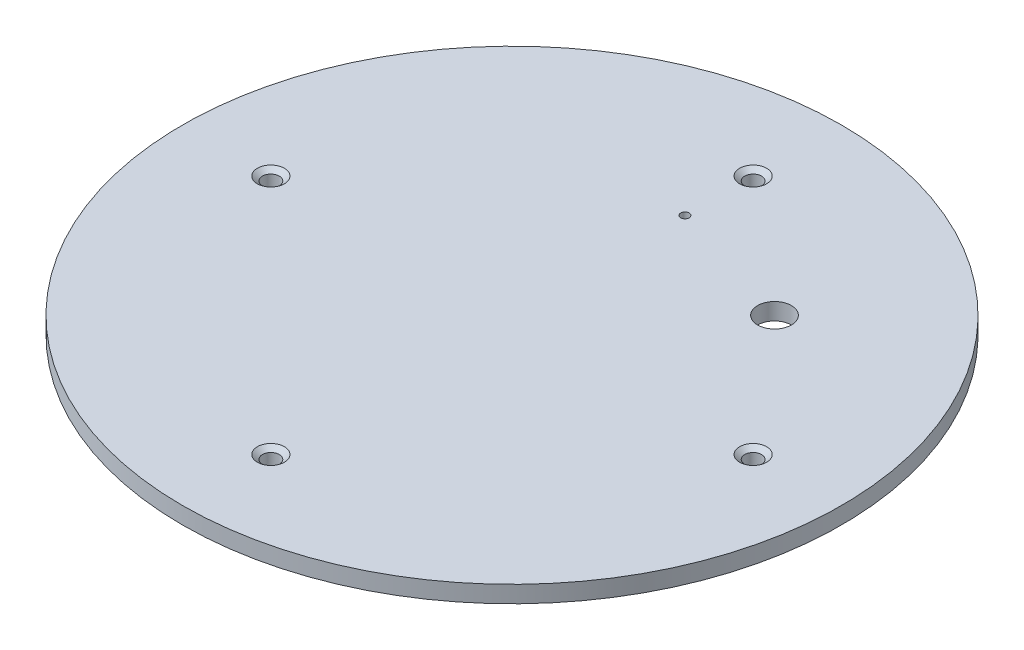
ISO-10303-21;
HEADER;
FILE_DESCRIPTION(('STEP AP214'),'2;1');
FILE_NAME('part.step','',(''),(''),'','','');
FILE_SCHEMA(('AUTOMOTIVE_DESIGN { 1 0 10303 214 1 1 1 1 }'));
ENDSEC;
DATA;
#1=APPLICATION_CONTEXT('core data for automotive mechanical design processes');
#2=APPLICATION_PROTOCOL_DEFINITION('international standard','automotive_design',2000,#1);
#3=PRODUCT_CONTEXT('',#1,'mechanical');
#4=PRODUCT('Part','Part','',(#3));
#5=PRODUCT_RELATED_PRODUCT_CATEGORY('part','',(#4));
#6=PRODUCT_DEFINITION_FORMATION('','',#4);
#7=PRODUCT_DEFINITION_CONTEXT('part definition',#1,'design');
#8=PRODUCT_DEFINITION('design','',#6,#7);
#9=PRODUCT_DEFINITION_SHAPE('','',#8);
#10=(LENGTH_UNIT() NAMED_UNIT(*) SI_UNIT(.MILLI.,.METRE.));
#11=(NAMED_UNIT(*) PLANE_ANGLE_UNIT() SI_UNIT($,.RADIAN.));
#12=(NAMED_UNIT(*) SI_UNIT($,.STERADIAN.) SOLID_ANGLE_UNIT());
#13=UNCERTAINTY_MEASURE_WITH_UNIT(LENGTH_MEASURE(1.E-05),#10,'distance_accuracy_value','');
#14=(GEOMETRIC_REPRESENTATION_CONTEXT(3) GLOBAL_UNCERTAINTY_ASSIGNED_CONTEXT((#13)) GLOBAL_UNIT_ASSIGNED_CONTEXT((#10,
#11,#12)) REPRESENTATION_CONTEXT('',''));
#15=CARTESIAN_POINT('',(0.,0.,0.));
#16=DIRECTION('',(0.,0.,1.));
#17=DIRECTION('',(1.,0.,0.));
#18=AXIS2_PLACEMENT_3D('',#15,#16,#17);
#19=CARTESIAN_POINT('',(0.,1.,0.));
#20=DIRECTION('',(0.,-1.,0.));
#21=DIRECTION('',(0.,0.,-1.));
#22=AXIS2_PLACEMENT_3D('',#19,#20,#21);
#23=CYLINDRICAL_SURFACE('',#22,19.53);
#24=CARTESIAN_POINT('',(0.,1.,0.));
#25=DIRECTION('',(0.,1.,0.));
#26=DIRECTION('',(0.,0.,1.));
#27=AXIS2_PLACEMENT_3D('',#24,#25,#26);
#28=CIRCLE('',#27,19.53);
#29=CARTESIAN_POINT('',(0.,1.,19.53));
#30=VERTEX_POINT('',#29);
#31=EDGE_CURVE('E10',#30,#30,#28,.T.);
#32=ORIENTED_EDGE('',*,*,#31,.F.);
#33=EDGE_LOOP('',(#32));
#34=FACE_BOUND('',#33,.T.);
#35=CARTESIAN_POINT('',(0.,0.,0.));
#36=DIRECTION('',(0.,1.,0.));
#37=DIRECTION('',(0.,0.,1.));
#38=AXIS2_PLACEMENT_3D('',#35,#36,#37);
#39=CIRCLE('',#38,19.53);
#40=CARTESIAN_POINT('',(0.,0.,19.53));
#41=VERTEX_POINT('',#40);
#42=EDGE_CURVE('E34',#41,#41,#39,.T.);
#43=ORIENTED_EDGE('',*,*,#42,.T.);
#44=EDGE_LOOP('',(#43));
#45=FACE_BOUND('',#44,.T.);
#46=ADVANCED_FACE('F31',(#34,#45),#23,.T.);
#47=CARTESIAN_POINT('',(0.,1.,0.));
#48=DIRECTION('',(0.,1.,0.));
#49=DIRECTION('',(0.,0.,1.));
#50=AXIS2_PLACEMENT_3D('',#47,#48,#49);
#51=PLANE('',#50);
#52=CARTESIAN_POINT('',(0.,1.,-14.29));
#53=DIRECTION('',(0.,1.,0.));
#54=DIRECTION('',(0.,0.,1.));
#55=AXIS2_PLACEMENT_3D('',#52,#53,#54);
#56=CIRCLE('',#55,0.8);
#57=CARTESIAN_POINT('',(0.,1.,-13.49));
#58=VERTEX_POINT('',#57);
#59=EDGE_CURVE('E87',#58,#58,#56,.T.);
#60=ORIENTED_EDGE('',*,*,#59,.F.);
#61=EDGE_LOOP('',(#60));
#62=FACE_BOUND('',#61,.T.);
#63=CARTESIAN_POINT('',(-14.29,1.,0.));
#64=DIRECTION('',(0.,1.,0.));
#65=DIRECTION('',(0.,0.,1.));
#66=AXIS2_PLACEMENT_3D('',#63,#64,#65);
#67=CIRCLE('',#66,0.8);
#68=CARTESIAN_POINT('',(-14.29,1.,0.8));
#69=VERTEX_POINT('',#68);
#70=EDGE_CURVE('E78',#69,#69,#67,.T.);
#71=ORIENTED_EDGE('',*,*,#70,.F.);
#72=EDGE_LOOP('',(#71));
#73=FACE_BOUND('',#72,.T.);
#74=CARTESIAN_POINT('',(0.,1.,14.29));
#75=DIRECTION('',(0.,1.,0.));
#76=DIRECTION('',(0.,0.,1.));
#77=AXIS2_PLACEMENT_3D('',#74,#75,#76);
#78=CIRCLE('',#77,0.8);
#79=CARTESIAN_POINT('',(0.,1.,15.09));
#80=VERTEX_POINT('',#79);
#81=EDGE_CURVE('E69',#80,#80,#78,.T.);
#82=ORIENTED_EDGE('',*,*,#81,.F.);
#83=EDGE_LOOP('',(#82));
#84=FACE_BOUND('',#83,.T.);
#85=CARTESIAN_POINT('',(14.29,1.,0.));
#86=DIRECTION('',(0.,1.,0.));
#87=DIRECTION('',(0.,0.,1.));
#88=AXIS2_PLACEMENT_3D('',#85,#86,#87);
#89=CIRCLE('',#88,0.8);
#90=CARTESIAN_POINT('',(14.29,1.,0.8));
#91=VERTEX_POINT('',#90);
#92=EDGE_CURVE('E60',#91,#91,#89,.T.);
#93=ORIENTED_EDGE('',*,*,#92,.F.);
#94=EDGE_LOOP('',(#93));
#95=FACE_BOUND('',#94,.T.);
#96=CARTESIAN_POINT('',(0.,1.,-10.25));
#97=DIRECTION('',(0.,1.,0.));
#98=DIRECTION('',(0.,0.,1.));
#99=AXIS2_PLACEMENT_3D('',#96,#97,#98);
#100=CIRCLE('',#99,0.25);
#101=CARTESIAN_POINT('',(0.,1.,-10.));
#102=VERTEX_POINT('',#101);
#103=EDGE_CURVE('E41',#102,#102,#100,.T.);
#104=ORIENTED_EDGE('',*,*,#103,.F.);
#105=EDGE_LOOP('',(#104));
#106=FACE_BOUND('',#105,.T.);
#107=CARTESIAN_POINT('',(7.77817459305201,1.,-7.77817459305204));
#108=DIRECTION('',(0.,1.,0.));
#109=DIRECTION('',(0.,0.,1.));
#110=AXIS2_PLACEMENT_3D('',#107,#108,#109);
#111=CIRCLE('',#110,1.00000000000001);
#112=CARTESIAN_POINT('',(7.77817459305201,1.,-6.77817459305203));
#113=VERTEX_POINT('',#112);
#114=EDGE_CURVE('E45',#113,#113,#111,.T.);
#115=ORIENTED_EDGE('',*,*,#114,.F.);
#116=EDGE_LOOP('',(#115));
#117=FACE_BOUND('',#116,.T.);
#118=ORIENTED_EDGE('',*,*,#31,.T.);
#119=EDGE_LOOP('',(#118));
#120=FACE_BOUND('',#119,.T.);
#121=ADVANCED_FACE('F93',(#62,#73,#84,#95,#106,#117,#120),#51,.T.);
#122=CARTESIAN_POINT('',(0.,0.,0.));
#123=DIRECTION('',(0.,1.,0.));
#124=DIRECTION('',(0.,0.,1.));
#125=AXIS2_PLACEMENT_3D('',#122,#123,#124);
#126=PLANE('',#125);
#127=CARTESIAN_POINT('',(0.,0.,-14.29));
#128=DIRECTION('',(0.,1.,0.));
#129=DIRECTION('',(0.,0.,1.));
#130=AXIS2_PLACEMENT_3D('',#127,#128,#129);
#131=CIRCLE('',#130,0.5);
#132=CARTESIAN_POINT('',(0.,0.,-13.79));
#133=VERTEX_POINT('',#132);
#134=EDGE_CURVE('E81',#133,#133,#131,.T.);
#135=ORIENTED_EDGE('',*,*,#134,.T.);
#136=EDGE_LOOP('',(#135));
#137=FACE_BOUND('',#136,.T.);
#138=CARTESIAN_POINT('',(-14.29,0.,0.));
#139=DIRECTION('',(0.,1.,0.));
#140=DIRECTION('',(0.,0.,1.));
#141=AXIS2_PLACEMENT_3D('',#138,#139,#140);
#142=CIRCLE('',#141,0.5);
#143=CARTESIAN_POINT('',(-14.29,0.,0.5));
#144=VERTEX_POINT('',#143);
#145=EDGE_CURVE('E72',#144,#144,#142,.T.);
#146=ORIENTED_EDGE('',*,*,#145,.T.);
#147=EDGE_LOOP('',(#146));
#148=FACE_BOUND('',#147,.T.);
#149=CARTESIAN_POINT('',(0.,0.,14.29));
#150=DIRECTION('',(0.,1.,0.));
#151=DIRECTION('',(0.,0.,1.));
#152=AXIS2_PLACEMENT_3D('',#149,#150,#151);
#153=CIRCLE('',#152,0.5);
#154=CARTESIAN_POINT('',(0.,0.,14.79));
#155=VERTEX_POINT('',#154);
#156=EDGE_CURVE('E63',#155,#155,#153,.T.);
#157=ORIENTED_EDGE('',*,*,#156,.T.);
#158=EDGE_LOOP('',(#157));
#159=FACE_BOUND('',#158,.T.);
#160=CARTESIAN_POINT('',(14.29,0.,0.));
#161=DIRECTION('',(0.,1.,0.));
#162=DIRECTION('',(0.,0.,1.));
#163=AXIS2_PLACEMENT_3D('',#160,#161,#162);
#164=CIRCLE('',#163,0.5);
#165=CARTESIAN_POINT('',(14.29,0.,0.5));
#166=VERTEX_POINT('',#165);
#167=EDGE_CURVE('E52',#166,#166,#164,.T.);
#168=ORIENTED_EDGE('',*,*,#167,.T.);
#169=EDGE_LOOP('',(#168));
#170=FACE_BOUND('',#169,.T.);
#171=CARTESIAN_POINT('',(0.,0.,-10.25));
#172=DIRECTION('',(0.,1.,0.));
#173=DIRECTION('',(0.,0.,1.));
#174=AXIS2_PLACEMENT_3D('',#171,#172,#173);
#175=CIRCLE('',#174,0.25);
#176=CARTESIAN_POINT('',(0.,0.,-10.));
#177=VERTEX_POINT('',#176);
#178=EDGE_CURVE('E48',#177,#177,#175,.T.);
#179=ORIENTED_EDGE('',*,*,#178,.T.);
#180=EDGE_LOOP('',(#179));
#181=FACE_BOUND('',#180,.T.);
#182=CARTESIAN_POINT('',(7.77817459305201,0.,-7.77817459305204));
#183=DIRECTION('',(0.,1.,0.));
#184=DIRECTION('',(0.,0.,1.));
#185=AXIS2_PLACEMENT_3D('',#182,#183,#184);
#186=CIRCLE('',#185,1.00000000000001);
#187=CARTESIAN_POINT('',(7.77817459305201,0.,-6.77817459305203));
#188=VERTEX_POINT('',#187);
#189=EDGE_CURVE('E49',#188,#188,#186,.T.);
#190=ORIENTED_EDGE('',*,*,#189,.T.);
#191=EDGE_LOOP('',(#190));
#192=FACE_BOUND('',#191,.T.);
#193=ORIENTED_EDGE('',*,*,#42,.F.);
#194=EDGE_LOOP('',(#193));
#195=FACE_BOUND('',#194,.T.);
#196=ADVANCED_FACE('F96',(#137,#148,#159,#170,#181,#192,#195),#126,.F.);
#197=CARTESIAN_POINT('',(7.77817459305201,0.,-7.77817459305204));
#198=DIRECTION('',(0.,1.,0.));
#199=DIRECTION('',(0.,0.,1.));
#200=AXIS2_PLACEMENT_3D('',#197,#198,#199);
#201=CYLINDRICAL_SURFACE('',#200,1.00000000000001);
#202=ORIENTED_EDGE('',*,*,#114,.T.);
#203=EDGE_LOOP('',(#202));
#204=FACE_BOUND('',#203,.T.);
#205=ORIENTED_EDGE('',*,*,#189,.F.);
#206=EDGE_LOOP('',(#205));
#207=FACE_BOUND('',#206,.T.);
#208=ADVANCED_FACE('F108',(#204,#207),#201,.F.);
#209=CARTESIAN_POINT('',(0.,0.,-10.25));
#210=DIRECTION('',(0.,1.,0.));
#211=DIRECTION('',(0.,0.,1.));
#212=AXIS2_PLACEMENT_3D('',#209,#210,#211);
#213=CYLINDRICAL_SURFACE('',#212,0.25);
#214=ORIENTED_EDGE('',*,*,#103,.T.);
#215=EDGE_LOOP('',(#214));
#216=FACE_BOUND('',#215,.T.);
#217=ORIENTED_EDGE('',*,*,#178,.F.);
#218=EDGE_LOOP('',(#217));
#219=FACE_BOUND('',#218,.T.);
#220=ADVANCED_FACE('F111',(#216,#219),#213,.F.);
#221=CARTESIAN_POINT('',(14.29,1.,0.));
#222=DIRECTION('',(0.,1.,0.));
#223=DIRECTION('',(0.,0.,1.));
#224=AXIS2_PLACEMENT_3D('',#221,#222,#223);
#225=CYLINDRICAL_SURFACE('',#224,0.5);
#226=ORIENTED_EDGE('',*,*,#167,.F.);
#227=EDGE_LOOP('',(#226));
#228=FACE_BOUND('',#227,.T.);
#229=CARTESIAN_POINT('',(14.29,0.748270110646816,0.));
#230=DIRECTION('',(0.,1.,0.));
#231=DIRECTION('',(0.,0.,1.));
#232=AXIS2_PLACEMENT_3D('',#229,#230,#231);
#233=CIRCLE('',#232,0.5);
#234=CARTESIAN_POINT('',(14.29,0.748270110646816,0.5));
#235=VERTEX_POINT('',#234);
#236=EDGE_CURVE('E57',#235,#235,#233,.T.);
#237=ORIENTED_EDGE('',*,*,#236,.T.);
#238=EDGE_LOOP('',(#237));
#239=FACE_BOUND('',#238,.T.);
#240=ADVANCED_FACE('F143',(#228,#239),#225,.F.);
#241=CARTESIAN_POINT('',(14.29,1.,0.));
#242=DIRECTION('',(0.,1.,0.));
#243=DIRECTION('',(0.,0.,1.));
#244=AXIS2_PLACEMENT_3D('',#241,#242,#243);
#245=CONICAL_SURFACE('',#244,0.8,0.872664625997165);
#246=ORIENTED_EDGE('',*,*,#236,.F.);
#247=EDGE_LOOP('',(#246));
#248=FACE_BOUND('',#247,.T.);
#249=ORIENTED_EDGE('',*,*,#92,.T.);
#250=EDGE_LOOP('',(#249));
#251=FACE_BOUND('',#250,.T.);
#252=ADVANCED_FACE('F150',(#248,#251),#245,.F.);
#253=CARTESIAN_POINT('',(0.,1.,14.29));
#254=DIRECTION('',(0.,1.,0.));
#255=DIRECTION('',(0.,0.,1.));
#256=AXIS2_PLACEMENT_3D('',#253,#254,#255);
#257=CYLINDRICAL_SURFACE('',#256,0.5);
#258=ORIENTED_EDGE('',*,*,#156,.F.);
#259=EDGE_LOOP('',(#258));
#260=FACE_BOUND('',#259,.T.);
#261=CARTESIAN_POINT('',(0.,0.748270110646816,14.29));
#262=DIRECTION('',(0.,1.,0.));
#263=DIRECTION('',(0.,0.,1.));
#264=AXIS2_PLACEMENT_3D('',#261,#262,#263);
#265=CIRCLE('',#264,0.5);
#266=CARTESIAN_POINT('',(0.,0.748270110646816,14.79));
#267=VERTEX_POINT('',#266);
#268=EDGE_CURVE('E66',#267,#267,#265,.T.);
#269=ORIENTED_EDGE('',*,*,#268,.T.);
#270=EDGE_LOOP('',(#269));
#271=FACE_BOUND('',#270,.T.);
#272=ADVANCED_FACE('F158',(#260,#271),#257,.F.);
#273=CARTESIAN_POINT('',(0.,1.,14.29));
#274=DIRECTION('',(0.,1.,0.));
#275=DIRECTION('',(0.,0.,1.));
#276=AXIS2_PLACEMENT_3D('',#273,#274,#275);
#277=CONICAL_SURFACE('',#276,0.8,0.872664625997165);
#278=ORIENTED_EDGE('',*,*,#268,.F.);
#279=EDGE_LOOP('',(#278));
#280=FACE_BOUND('',#279,.T.);
#281=ORIENTED_EDGE('',*,*,#81,.T.);
#282=EDGE_LOOP('',(#281));
#283=FACE_BOUND('',#282,.T.);
#284=ADVANCED_FACE('F166',(#280,#283),#277,.F.);
#285=CARTESIAN_POINT('',(-14.29,1.,0.));
#286=DIRECTION('',(0.,1.,0.));
#287=DIRECTION('',(0.,0.,1.));
#288=AXIS2_PLACEMENT_3D('',#285,#286,#287);
#289=CYLINDRICAL_SURFACE('',#288,0.5);
#290=ORIENTED_EDGE('',*,*,#145,.F.);
#291=EDGE_LOOP('',(#290));
#292=FACE_BOUND('',#291,.T.);
#293=CARTESIAN_POINT('',(-14.29,0.748270110646816,0.));
#294=DIRECTION('',(0.,1.,0.));
#295=DIRECTION('',(0.,0.,1.));
#296=AXIS2_PLACEMENT_3D('',#293,#294,#295);
#297=CIRCLE('',#296,0.5);
#298=CARTESIAN_POINT('',(-14.29,0.748270110646816,0.5));
#299=VERTEX_POINT('',#298);
#300=EDGE_CURVE('E75',#299,#299,#297,.T.);
#301=ORIENTED_EDGE('',*,*,#300,.T.);
#302=EDGE_LOOP('',(#301));
#303=FACE_BOUND('',#302,.T.);
#304=ADVANCED_FACE('F174',(#292,#303),#289,.F.);
#305=CARTESIAN_POINT('',(-14.29,1.,0.));
#306=DIRECTION('',(0.,1.,0.));
#307=DIRECTION('',(0.,0.,1.));
#308=AXIS2_PLACEMENT_3D('',#305,#306,#307);
#309=CONICAL_SURFACE('',#308,0.8,0.872664625997165);
#310=ORIENTED_EDGE('',*,*,#300,.F.);
#311=EDGE_LOOP('',(#310));
#312=FACE_BOUND('',#311,.T.);
#313=ORIENTED_EDGE('',*,*,#70,.T.);
#314=EDGE_LOOP('',(#313));
#315=FACE_BOUND('',#314,.T.);
#316=ADVANCED_FACE('F182',(#312,#315),#309,.F.);
#317=CARTESIAN_POINT('',(0.,1.,-14.29));
#318=DIRECTION('',(0.,1.,0.));
#319=DIRECTION('',(0.,0.,1.));
#320=AXIS2_PLACEMENT_3D('',#317,#318,#319);
#321=CYLINDRICAL_SURFACE('',#320,0.5);
#322=ORIENTED_EDGE('',*,*,#134,.F.);
#323=EDGE_LOOP('',(#322));
#324=FACE_BOUND('',#323,.T.);
#325=CARTESIAN_POINT('',(0.,0.748270110646816,-14.29));
#326=DIRECTION('',(0.,1.,0.));
#327=DIRECTION('',(0.,0.,1.));
#328=AXIS2_PLACEMENT_3D('',#325,#326,#327);
#329=CIRCLE('',#328,0.5);
#330=CARTESIAN_POINT('',(0.,0.748270110646816,-13.79));
#331=VERTEX_POINT('',#330);
#332=EDGE_CURVE('E84',#331,#331,#329,.T.);
#333=ORIENTED_EDGE('',*,*,#332,.T.);
#334=EDGE_LOOP('',(#333));
#335=FACE_BOUND('',#334,.T.);
#336=ADVANCED_FACE('F190',(#324,#335),#321,.F.);
#337=CARTESIAN_POINT('',(0.,1.,-14.29));
#338=DIRECTION('',(0.,1.,0.));
#339=DIRECTION('',(0.,0.,1.));
#340=AXIS2_PLACEMENT_3D('',#337,#338,#339);
#341=CONICAL_SURFACE('',#340,0.8,0.872664625997165);
#342=ORIENTED_EDGE('',*,*,#332,.F.);
#343=EDGE_LOOP('',(#342));
#344=FACE_BOUND('',#343,.T.);
#345=ORIENTED_EDGE('',*,*,#59,.T.);
#346=EDGE_LOOP('',(#345));
#347=FACE_BOUND('',#346,.T.);
#348=ADVANCED_FACE('F91',(#344,#347),#341,.F.);
#349=CLOSED_SHELL('',(#46,#121,#196,#208,#220,#240,#252,#272,#284,#304,#316,#336,#348));
#350=MANIFOLD_SOLID_BREP('B2',#349);
#351=ADVANCED_BREP_SHAPE_REPRESENTATION('',(#18,#350),#14);
#352=SHAPE_DEFINITION_REPRESENTATION(#9,#351);
ENDSEC;
END-ISO-10303-21;
